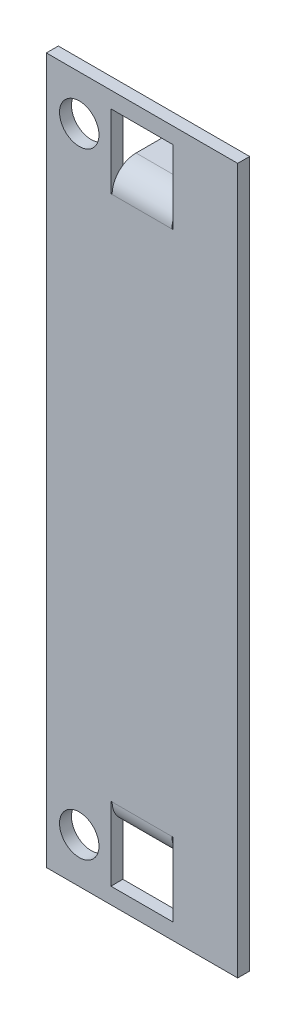
ISO-10303-21;
HEADER;
FILE_DESCRIPTION(('STEP AP214'),'2;1');
FILE_NAME('part.step','',(''),(''),'','','');
FILE_SCHEMA(('AUTOMOTIVE_DESIGN { 1 0 10303 214 1 1 1 1 }'));
ENDSEC;
DATA;
#1=APPLICATION_CONTEXT('core data for automotive mechanical design processes');
#2=APPLICATION_PROTOCOL_DEFINITION('international standard','automotive_design',2000,#1);
#3=PRODUCT_CONTEXT('',#1,'mechanical');
#4=PRODUCT('Part','Part','',(#3));
#5=PRODUCT_RELATED_PRODUCT_CATEGORY('part','',(#4));
#6=PRODUCT_DEFINITION_FORMATION('','',#4);
#7=PRODUCT_DEFINITION_CONTEXT('part definition',#1,'design');
#8=PRODUCT_DEFINITION('design','',#6,#7);
#9=PRODUCT_DEFINITION_SHAPE('','',#8);
#10=(LENGTH_UNIT() NAMED_UNIT(*) SI_UNIT(.MILLI.,.METRE.));
#11=(NAMED_UNIT(*) PLANE_ANGLE_UNIT() SI_UNIT($,.RADIAN.));
#12=(NAMED_UNIT(*) SI_UNIT($,.STERADIAN.) SOLID_ANGLE_UNIT());
#13=UNCERTAINTY_MEASURE_WITH_UNIT(LENGTH_MEASURE(1.E-05),#10,'distance_accuracy_value','');
#14=(GEOMETRIC_REPRESENTATION_CONTEXT(3) GLOBAL_UNCERTAINTY_ASSIGNED_CONTEXT((#13)) GLOBAL_UNIT_ASSIGNED_CONTEXT((#10,
#11,#12)) REPRESENTATION_CONTEXT('',''));
#15=CARTESIAN_POINT('',(0.,0.,0.));
#16=DIRECTION('',(0.,0.,1.));
#17=DIRECTION('',(1.,0.,0.));
#18=AXIS2_PLACEMENT_3D('',#15,#16,#17);
#19=CARTESIAN_POINT('',(-12.7,44.,142.2));
#20=DIRECTION('',(0.,1.,0.));
#21=DIRECTION('',(0.,0.,1.));
#22=AXIS2_PLACEMENT_3D('',#19,#20,#21);
#23=PLANE('',#22);
#24=DIRECTION('',(-1.,0.,0.));
#25=VECTOR('',#24,1.);
#26=CARTESIAN_POINT('',(0.,44.,142.));
#27=LINE('',#26,#25);
#28=CARTESIAN_POINT('',(-12.5,44.,142.));
#29=VERTEX_POINT('',#28);
#30=CARTESIAN_POINT('',(-12.7,44.,142.));
#31=VERTEX_POINT('',#30);
#32=EDGE_CURVE('E67',#29,#31,#27,.T.);
#33=ORIENTED_EDGE('',*,*,#32,.F.);
#34=DIRECTION('',(0.,0.,-1.));
#35=VECTOR('',#34,1.);
#36=CARTESIAN_POINT('',(-12.5,44.,140.));
#37=LINE('',#36,#35);
#38=CARTESIAN_POINT('',(-12.5,44.,140.));
#39=VERTEX_POINT('',#38);
#40=EDGE_CURVE('E266',#29,#39,#37,.T.);
#41=ORIENTED_EDGE('',*,*,#40,.T.);
#42=DIRECTION('',(-1.,0.,0.));
#43=VECTOR('',#42,1.);
#44=CARTESIAN_POINT('',(0.,44.,140.));
#45=LINE('',#44,#43);
#46=CARTESIAN_POINT('',(-12.7,44.,140.));
#47=VERTEX_POINT('',#46);
#48=EDGE_CURVE('E359',#39,#47,#45,.T.);
#49=ORIENTED_EDGE('',*,*,#48,.T.);
#50=DIRECTION('',(0.,0.,-1.));
#51=VECTOR('',#50,1.);
#52=CARTESIAN_POINT('',(-12.7,44.,142.2));
#53=LINE('',#52,#51);
#54=EDGE_CURVE('E228',#31,#47,#53,.T.);
#55=ORIENTED_EDGE('',*,*,#54,.F.);
#56=EDGE_LOOP('',(#33,#41,#49,#55));
#57=FACE_BOUND('',#56,.T.);
#58=ADVANCED_FACE('F41',(#57),#23,.T.);
#59=CARTESIAN_POINT('',(-2.3,-44.,142.2));
#60=DIRECTION('',(0.,-1.,0.));
#61=DIRECTION('',(0.,0.,-1.));
#62=AXIS2_PLACEMENT_3D('',#59,#60,#61);
#63=PLANE('',#62);
#64=DIRECTION('',(1.,0.,0.));
#65=VECTOR('',#64,1.);
#66=CARTESIAN_POINT('',(0.,-44.,140.));
#67=LINE('',#66,#65);
#68=CARTESIAN_POINT('',(-12.7,-44.,140.));
#69=VERTEX_POINT('',#68);
#70=CARTESIAN_POINT('',(-12.5,-44.,140.));
#71=VERTEX_POINT('',#70);
#72=EDGE_CURVE('E368',#69,#71,#67,.T.);
#73=ORIENTED_EDGE('',*,*,#72,.T.);
#74=DIRECTION('',(0.,0.,1.));
#75=VECTOR('',#74,1.);
#76=CARTESIAN_POINT('',(-12.5,-44.,140.));
#77=LINE('',#76,#75);
#78=CARTESIAN_POINT('',(-12.5,-44.,142.));
#79=VERTEX_POINT('',#78);
#80=EDGE_CURVE('E59',#71,#79,#77,.T.);
#81=ORIENTED_EDGE('',*,*,#80,.T.);
#82=DIRECTION('',(1.,0.,0.));
#83=VECTOR('',#82,1.);
#84=CARTESIAN_POINT('',(0.,-44.,142.));
#85=LINE('',#84,#83);
#86=CARTESIAN_POINT('',(-12.7,-44.,142.));
#87=VERTEX_POINT('',#86);
#88=EDGE_CURVE('E314',#87,#79,#85,.T.);
#89=ORIENTED_EDGE('',*,*,#88,.F.);
#90=DIRECTION('',(0.,0.,-1.));
#91=VECTOR('',#90,1.);
#92=CARTESIAN_POINT('',(-12.7,-44.,142.2));
#93=LINE('',#92,#91);
#94=EDGE_CURVE('E284',#87,#69,#93,.T.);
#95=ORIENTED_EDGE('',*,*,#94,.T.);
#96=EDGE_LOOP('',(#73,#81,#89,#95));
#97=FACE_BOUND('',#96,.T.);
#98=ADVANCED_FACE('F435',(#97),#63,.T.);
#99=CARTESIAN_POINT('',(0.,0.,142.));
#100=DIRECTION('',(0.,0.,1.));
#101=DIRECTION('',(1.,0.,0.));
#102=AXIS2_PLACEMENT_3D('',#99,#100,#101);
#103=PLANE('',#102);
#104=CARTESIAN_POINT('',(-18.,-51.5,142.));
#105=DIRECTION('',(0.,0.,1.));
#106=DIRECTION('',(1.,0.,0.));
#107=AXIS2_PLACEMENT_3D('',#104,#105,#106);
#108=CIRCLE('',#107,3.3);
#109=CARTESIAN_POINT('',(-14.7,-51.5,142.));
#110=VERTEX_POINT('',#109);
#111=EDGE_CURVE('E241',#110,#110,#108,.F.);
#112=ORIENTED_EDGE('',*,*,#111,.T.);
#113=EDGE_LOOP('',(#112));
#114=FACE_BOUND('',#113,.T.);
#115=CARTESIAN_POINT('',(-18.,51.5,142.));
#116=DIRECTION('',(0.,0.,1.));
#117=DIRECTION('',(1.,0.,0.));
#118=AXIS2_PLACEMENT_3D('',#115,#116,#117);
#119=CIRCLE('',#118,3.3);
#120=CARTESIAN_POINT('',(-14.7,51.5,142.));
#121=VERTEX_POINT('',#120);
#122=EDGE_CURVE('E375',#121,#121,#119,.F.);
#123=ORIENTED_EDGE('',*,*,#122,.T.);
#124=EDGE_LOOP('',(#123));
#125=FACE_BOUND('',#124,.T.);
#126=DIRECTION('',(0.,-1.,0.));
#127=VECTOR('',#126,1.);
#128=CARTESIAN_POINT('',(-23.5,59.,142.));
#129=LINE('',#128,#127);
#130=CARTESIAN_POINT('',(-23.5,59.,142.));
#131=VERTEX_POINT('',#130);
#132=CARTESIAN_POINT('',(-23.5,-59.,142.));
#133=VERTEX_POINT('',#132);
#134=EDGE_CURVE('E326',#131,#133,#129,.T.);
#135=ORIENTED_EDGE('',*,*,#134,.T.);
#136=DIRECTION('',(1.,0.,0.));
#137=VECTOR('',#136,1.);
#138=CARTESIAN_POINT('',(-23.5,-59.,142.));
#139=LINE('',#138,#137);
#140=CARTESIAN_POINT('',(8.5,-59.,142.));
#141=VERTEX_POINT('',#140);
#142=EDGE_CURVE('E328',#133,#141,#139,.T.);
#143=ORIENTED_EDGE('',*,*,#142,.T.);
#144=DIRECTION('',(0.,1.,0.));
#145=VECTOR('',#144,1.);
#146=CARTESIAN_POINT('',(8.5,-59.,142.));
#147=LINE('',#146,#145);
#148=CARTESIAN_POINT('',(8.5,59.,142.));
#149=VERTEX_POINT('',#148);
#150=EDGE_CURVE('E335',#141,#149,#147,.T.);
#151=ORIENTED_EDGE('',*,*,#150,.T.);
#152=DIRECTION('',(-1.,0.,0.));
#153=VECTOR('',#152,1.);
#154=CARTESIAN_POINT('',(8.5,59.,142.));
#155=LINE('',#154,#153);
#156=EDGE_CURVE('E331',#149,#131,#155,.T.);
#157=ORIENTED_EDGE('',*,*,#156,.T.);
#158=EDGE_LOOP('',(#135,#143,#151,#157));
#159=FACE_BOUND('',#158,.T.);
#160=CARTESIAN_POINT('',(-2.3,44.,142.));
#161=VERTEX_POINT('',#160);
#162=CARTESIAN_POINT('',(-2.5,44.,142.));
#163=VERTEX_POINT('',#162);
#164=EDGE_CURVE('E307',#161,#163,#27,.T.);
#165=ORIENTED_EDGE('',*,*,#164,.T.);
#166=DIRECTION('',(-1.,0.,0.));
#167=VECTOR('',#166,1.);
#168=CARTESIAN_POINT('',(-2.5,44.,142.));
#169=LINE('',#168,#167);
#170=EDGE_CURVE('E236',#163,#29,#169,.T.);
#171=ORIENTED_EDGE('',*,*,#170,.T.);
#172=ORIENTED_EDGE('',*,*,#32,.T.);
#173=DIRECTION('',(0.,1.,0.));
#174=VECTOR('',#173,1.);
#175=CARTESIAN_POINT('',(-12.7,0.,142.));
#176=LINE('',#175,#174);
#177=CARTESIAN_POINT('',(-12.7,56.3,142.));
#178=VERTEX_POINT('',#177);
#179=EDGE_CURVE('E309',#31,#178,#176,.T.);
#180=ORIENTED_EDGE('',*,*,#179,.T.);
#181=DIRECTION('',(1.,0.,0.));
#182=VECTOR('',#181,1.);
#183=CARTESIAN_POINT('',(0.,56.3,142.));
#184=LINE('',#183,#182);
#185=CARTESIAN_POINT('',(-2.3,56.3,142.));
#186=VERTEX_POINT('',#185);
#187=EDGE_CURVE('E294',#178,#186,#184,.T.);
#188=ORIENTED_EDGE('',*,*,#187,.T.);
#189=DIRECTION('',(0.,-1.,0.));
#190=VECTOR('',#189,1.);
#191=CARTESIAN_POINT('',(-2.3,0.,142.));
#192=LINE('',#191,#190);
#193=EDGE_CURVE('E304',#186,#161,#192,.T.);
#194=ORIENTED_EDGE('',*,*,#193,.T.);
#195=EDGE_LOOP('',(#165,#171,#172,#180,#188,#194));
#196=FACE_BOUND('',#195,.T.);
#197=DIRECTION('',(-1.,0.,0.));
#198=VECTOR('',#197,1.);
#199=CARTESIAN_POINT('',(0.,-56.3,142.));
#200=LINE('',#199,#198);
#201=CARTESIAN_POINT('',(-2.3,-56.3,142.));
#202=VERTEX_POINT('',#201);
#203=CARTESIAN_POINT('',(-12.7,-56.3,142.));
#204=VERTEX_POINT('',#203);
#205=EDGE_CURVE('E317',#202,#204,#200,.T.);
#206=ORIENTED_EDGE('',*,*,#205,.T.);
#207=DIRECTION('',(0.,1.,0.));
#208=VECTOR('',#207,1.);
#209=CARTESIAN_POINT('',(-12.7,0.,142.));
#210=LINE('',#209,#208);
#211=EDGE_CURVE('E325',#204,#87,#210,.T.);
#212=ORIENTED_EDGE('',*,*,#211,.T.);
#213=ORIENTED_EDGE('',*,*,#88,.T.);
#214=DIRECTION('',(-1.,0.,0.));
#215=VECTOR('',#214,1.);
#216=CARTESIAN_POINT('',(-2.5,-44.,142.));
#217=LINE('',#216,#215);
#218=CARTESIAN_POINT('',(-2.5,-44.,142.));
#219=VERTEX_POINT('',#218);
#220=EDGE_CURVE('E386',#219,#79,#217,.T.);
#221=ORIENTED_EDGE('',*,*,#220,.F.);
#222=CARTESIAN_POINT('',(-2.3,-44.,142.));
#223=VERTEX_POINT('',#222);
#224=EDGE_CURVE('E311',#219,#223,#85,.T.);
#225=ORIENTED_EDGE('',*,*,#224,.T.);
#226=DIRECTION('',(0.,-1.,0.));
#227=VECTOR('',#226,1.);
#228=CARTESIAN_POINT('',(-2.3,0.,142.));
#229=LINE('',#228,#227);
#230=EDGE_CURVE('E316',#223,#202,#229,.T.);
#231=ORIENTED_EDGE('',*,*,#230,.T.);
#232=EDGE_LOOP('',(#206,#212,#213,#221,#225,#231));
#233=FACE_BOUND('',#232,.T.);
#234=ADVANCED_FACE('F438',(#114,#125,#159,#196,#233),#103,.T.);
#235=CARTESIAN_POINT('',(0.,0.,140.));
#236=DIRECTION('',(0.,0.,1.));
#237=DIRECTION('',(1.,0.,0.));
#238=AXIS2_PLACEMENT_3D('',#235,#236,#237);
#239=PLANE('',#238);
#240=CARTESIAN_POINT('',(-18.,-51.5,140.));
#241=DIRECTION('',(0.,0.,1.));
#242=DIRECTION('',(1.,0.,0.));
#243=AXIS2_PLACEMENT_3D('',#240,#241,#242);
#244=CIRCLE('',#243,3.3);
#245=CARTESIAN_POINT('',(-14.7,-51.5,140.));
#246=VERTEX_POINT('',#245);
#247=EDGE_CURVE('E44',#246,#246,#244,.F.);
#248=ORIENTED_EDGE('',*,*,#247,.F.);
#249=EDGE_LOOP('',(#248));
#250=FACE_BOUND('',#249,.T.);
#251=CARTESIAN_POINT('',(-18.,51.5,140.));
#252=DIRECTION('',(0.,0.,1.));
#253=DIRECTION('',(1.,0.,0.));
#254=AXIS2_PLACEMENT_3D('',#251,#252,#253);
#255=CIRCLE('',#254,3.3);
#256=CARTESIAN_POINT('',(-14.7,51.5,140.));
#257=VERTEX_POINT('',#256);
#258=EDGE_CURVE('E367',#257,#257,#255,.F.);
#259=ORIENTED_EDGE('',*,*,#258,.F.);
#260=EDGE_LOOP('',(#259));
#261=FACE_BOUND('',#260,.T.);
#262=DIRECTION('',(0.,1.,0.));
#263=VECTOR('',#262,1.);
#264=CARTESIAN_POINT('',(-12.7,0.,140.));
#265=LINE('',#264,#263);
#266=CARTESIAN_POINT('',(-12.7,56.3,140.));
#267=VERTEX_POINT('',#266);
#268=EDGE_CURVE('E362',#47,#267,#265,.T.);
#269=ORIENTED_EDGE('',*,*,#268,.F.);
#270=ORIENTED_EDGE('',*,*,#48,.F.);
#271=DIRECTION('',(-1.,0.,0.));
#272=VECTOR('',#271,1.);
#273=CARTESIAN_POINT('',(-2.5,44.,140.));
#274=LINE('',#273,#272);
#275=CARTESIAN_POINT('',(-2.5,44.,140.));
#276=VERTEX_POINT('',#275);
#277=EDGE_CURVE('E238',#276,#39,#274,.T.);
#278=ORIENTED_EDGE('',*,*,#277,.F.);
#279=CARTESIAN_POINT('',(-2.3,44.,140.));
#280=VERTEX_POINT('',#279);
#281=EDGE_CURVE('E356',#280,#276,#45,.T.);
#282=ORIENTED_EDGE('',*,*,#281,.F.);
#283=DIRECTION('',(0.,-1.,0.));
#284=VECTOR('',#283,1.);
#285=CARTESIAN_POINT('',(-2.3,0.,140.));
#286=LINE('',#285,#284);
#287=CARTESIAN_POINT('',(-2.3,56.3,140.));
#288=VERTEX_POINT('',#287);
#289=EDGE_CURVE('E360',#288,#280,#286,.T.);
#290=ORIENTED_EDGE('',*,*,#289,.F.);
#291=DIRECTION('',(1.,0.,0.));
#292=VECTOR('',#291,1.);
#293=CARTESIAN_POINT('',(0.,56.3,140.));
#294=LINE('',#293,#292);
#295=EDGE_CURVE('E355',#267,#288,#294,.T.);
#296=ORIENTED_EDGE('',*,*,#295,.F.);
#297=EDGE_LOOP('',(#269,#270,#278,#282,#290,#296));
#298=FACE_BOUND('',#297,.T.);
#299=DIRECTION('',(0.,-1.,0.));
#300=VECTOR('',#299,1.);
#301=CARTESIAN_POINT('',(-23.5,59.,140.));
#302=LINE('',#301,#300);
#303=CARTESIAN_POINT('',(-23.5,59.,140.));
#304=VERTEX_POINT('',#303);
#305=CARTESIAN_POINT('',(-23.5,-59.,140.));
#306=VERTEX_POINT('',#305);
#307=EDGE_CURVE('E324',#304,#306,#302,.T.);
#308=ORIENTED_EDGE('',*,*,#307,.F.);
#309=DIRECTION('',(-1.,0.,0.));
#310=VECTOR('',#309,1.);
#311=CARTESIAN_POINT('',(8.5,59.,140.));
#312=LINE('',#311,#310);
#313=CARTESIAN_POINT('',(8.5,59.,140.));
#314=VERTEX_POINT('',#313);
#315=EDGE_CURVE('E329',#314,#304,#312,.T.);
#316=ORIENTED_EDGE('',*,*,#315,.F.);
#317=DIRECTION('',(0.,1.,0.));
#318=VECTOR('',#317,1.);
#319=CARTESIAN_POINT('',(8.5,-59.,140.));
#320=LINE('',#319,#318);
#321=CARTESIAN_POINT('',(8.5,-59.,140.));
#322=VERTEX_POINT('',#321);
#323=EDGE_CURVE('E342',#322,#314,#320,.T.);
#324=ORIENTED_EDGE('',*,*,#323,.F.);
#325=DIRECTION('',(1.,0.,0.));
#326=VECTOR('',#325,1.);
#327=CARTESIAN_POINT('',(-23.5,-59.,140.));
#328=LINE('',#327,#326);
#329=EDGE_CURVE('E338',#306,#322,#328,.T.);
#330=ORIENTED_EDGE('',*,*,#329,.F.);
#331=EDGE_LOOP('',(#308,#316,#324,#330));
#332=FACE_BOUND('',#331,.T.);
#333=DIRECTION('',(0.,1.,0.));
#334=VECTOR('',#333,1.);
#335=CARTESIAN_POINT('',(-12.7,0.,140.));
#336=LINE('',#335,#334);
#337=CARTESIAN_POINT('',(-12.7,-56.3,140.));
#338=VERTEX_POINT('',#337);
#339=EDGE_CURVE('E11',#338,#69,#336,.T.);
#340=ORIENTED_EDGE('',*,*,#339,.F.);
#341=DIRECTION('',(-1.,0.,0.));
#342=VECTOR('',#341,1.);
#343=CARTESIAN_POINT('',(0.,-56.3,140.));
#344=LINE('',#343,#342);
#345=CARTESIAN_POINT('',(-2.3,-56.3,140.));
#346=VERTEX_POINT('',#345);
#347=EDGE_CURVE('E49',#346,#338,#344,.T.);
#348=ORIENTED_EDGE('',*,*,#347,.F.);
#349=DIRECTION('',(0.,-1.,0.));
#350=VECTOR('',#349,1.);
#351=CARTESIAN_POINT('',(-2.3,0.,140.));
#352=LINE('',#351,#350);
#353=CARTESIAN_POINT('',(-2.3,-44.,140.));
#354=VERTEX_POINT('',#353);
#355=EDGE_CURVE('E366',#354,#346,#352,.T.);
#356=ORIENTED_EDGE('',*,*,#355,.F.);
#357=CARTESIAN_POINT('',(-2.5,-44.,140.));
#358=VERTEX_POINT('',#357);
#359=EDGE_CURVE('E364',#358,#354,#67,.T.);
#360=ORIENTED_EDGE('',*,*,#359,.F.);
#361=DIRECTION('',(-1.,0.,0.));
#362=VECTOR('',#361,1.);
#363=CARTESIAN_POINT('',(-2.5,-44.,140.));
#364=LINE('',#363,#362);
#365=EDGE_CURVE('E405',#358,#71,#364,.T.);
#366=ORIENTED_EDGE('',*,*,#365,.T.);
#367=ORIENTED_EDGE('',*,*,#72,.F.);
#368=EDGE_LOOP('',(#340,#348,#356,#360,#366,#367));
#369=FACE_BOUND('',#368,.T.);
#370=ADVANCED_FACE('F483',(#250,#261,#298,#332,#369),#239,.F.);
#371=CARTESIAN_POINT('',(-23.5,59.,142.));
#372=DIRECTION('',(1.,0.,0.));
#373=DIRECTION('',(0.,0.,-1.));
#374=AXIS2_PLACEMENT_3D('',#371,#372,#373);
#375=PLANE('',#374);
#376=ORIENTED_EDGE('',*,*,#307,.T.);
#377=DIRECTION('',(0.,0.,-1.));
#378=VECTOR('',#377,1.);
#379=CARTESIAN_POINT('',(-23.5,-59.,142.));
#380=LINE('',#379,#378);
#381=EDGE_CURVE('E352',#133,#306,#380,.T.);
#382=ORIENTED_EDGE('',*,*,#381,.F.);
#383=ORIENTED_EDGE('',*,*,#134,.F.);
#384=DIRECTION('',(0.,0.,-1.));
#385=VECTOR('',#384,1.);
#386=CARTESIAN_POINT('',(-23.5,59.,142.));
#387=LINE('',#386,#385);
#388=EDGE_CURVE('E336',#131,#304,#387,.T.);
#389=ORIENTED_EDGE('',*,*,#388,.T.);
#390=EDGE_LOOP('',(#376,#382,#383,#389));
#391=FACE_BOUND('',#390,.T.);
#392=ADVANCED_FACE('F43',(#391),#375,.F.);
#393=CARTESIAN_POINT('',(-23.5,-59.,142.));
#394=DIRECTION('',(0.,1.,0.));
#395=DIRECTION('',(0.,0.,1.));
#396=AXIS2_PLACEMENT_3D('',#393,#394,#395);
#397=PLANE('',#396);
#398=ORIENTED_EDGE('',*,*,#329,.T.);
#399=DIRECTION('',(0.,0.,-1.));
#400=VECTOR('',#399,1.);
#401=CARTESIAN_POINT('',(8.5,-59.,142.));
#402=LINE('',#401,#400);
#403=EDGE_CURVE('E349',#141,#322,#402,.T.);
#404=ORIENTED_EDGE('',*,*,#403,.F.);
#405=ORIENTED_EDGE('',*,*,#142,.F.);
#406=ORIENTED_EDGE('',*,*,#381,.T.);
#407=EDGE_LOOP('',(#398,#404,#405,#406));
#408=FACE_BOUND('',#407,.T.);
#409=ADVANCED_FACE('F551',(#408),#397,.F.);
#410=CARTESIAN_POINT('',(8.5,-59.,142.));
#411=DIRECTION('',(-1.,0.,0.));
#412=DIRECTION('',(0.,0.,1.));
#413=AXIS2_PLACEMENT_3D('',#410,#411,#412);
#414=PLANE('',#413);
#415=ORIENTED_EDGE('',*,*,#323,.T.);
#416=DIRECTION('',(0.,0.,-1.));
#417=VECTOR('',#416,1.);
#418=CARTESIAN_POINT('',(8.5,59.,142.));
#419=LINE('',#418,#417);
#420=EDGE_CURVE('E347',#149,#314,#419,.T.);
#421=ORIENTED_EDGE('',*,*,#420,.F.);
#422=ORIENTED_EDGE('',*,*,#150,.F.);
#423=ORIENTED_EDGE('',*,*,#403,.T.);
#424=EDGE_LOOP('',(#415,#421,#422,#423));
#425=FACE_BOUND('',#424,.T.);
#426=ADVANCED_FACE('F552',(#425),#414,.F.);
#427=CARTESIAN_POINT('',(8.5,59.,142.));
#428=DIRECTION('',(0.,-1.,0.));
#429=DIRECTION('',(0.,0.,-1.));
#430=AXIS2_PLACEMENT_3D('',#427,#428,#429);
#431=PLANE('',#430);
#432=ORIENTED_EDGE('',*,*,#315,.T.);
#433=ORIENTED_EDGE('',*,*,#388,.F.);
#434=ORIENTED_EDGE('',*,*,#156,.F.);
#435=ORIENTED_EDGE('',*,*,#420,.T.);
#436=EDGE_LOOP('',(#432,#433,#434,#435));
#437=FACE_BOUND('',#436,.T.);
#438=ADVANCED_FACE('F451',(#437),#431,.F.);
#439=CARTESIAN_POINT('',(-12.7,56.3,142.2));
#440=DIRECTION('',(1.,0.,0.));
#441=DIRECTION('',(0.,0.,-1.));
#442=AXIS2_PLACEMENT_3D('',#439,#440,#441);
#443=PLANE('',#442);
#444=ORIENTED_EDGE('',*,*,#54,.T.);
#445=ORIENTED_EDGE('',*,*,#268,.T.);
#446=DIRECTION('',(0.,0.,-1.));
#447=VECTOR('',#446,1.);
#448=CARTESIAN_POINT('',(-12.7,56.3,142.2));
#449=LINE('',#448,#447);
#450=EDGE_CURVE('E287',#178,#267,#449,.T.);
#451=ORIENTED_EDGE('',*,*,#450,.F.);
#452=ORIENTED_EDGE('',*,*,#179,.F.);
#453=EDGE_LOOP('',(#444,#445,#451,#452));
#454=FACE_BOUND('',#453,.T.);
#455=ADVANCED_FACE('F446',(#454),#443,.T.);
#456=DIRECTION('',(0.,0.,-1.));
#457=VECTOR('',#456,1.);
#458=CARTESIAN_POINT('',(-2.5,44.,140.));
#459=LINE('',#458,#457);
#460=EDGE_CURVE('E279',#163,#276,#459,.T.);
#461=ORIENTED_EDGE('',*,*,#460,.F.);
#462=ORIENTED_EDGE('',*,*,#164,.F.);
#463=DIRECTION('',(0.,0.,-1.));
#464=VECTOR('',#463,1.);
#465=CARTESIAN_POINT('',(-2.3,44.,142.2));
#466=LINE('',#465,#464);
#467=EDGE_CURVE('E235',#161,#280,#466,.T.);
#468=ORIENTED_EDGE('',*,*,#467,.T.);
#469=ORIENTED_EDGE('',*,*,#281,.T.);
#470=EDGE_LOOP('',(#461,#462,#468,#469));
#471=FACE_BOUND('',#470,.T.);
#472=ADVANCED_FACE('F432',(#471),#23,.T.);
#473=CARTESIAN_POINT('',(-2.3,44.,142.2));
#474=DIRECTION('',(-1.,0.,0.));
#475=DIRECTION('',(0.,0.,1.));
#476=AXIS2_PLACEMENT_3D('',#473,#474,#475);
#477=PLANE('',#476);
#478=DIRECTION('',(0.,0.,-1.));
#479=VECTOR('',#478,1.);
#480=CARTESIAN_POINT('',(-2.3,56.3,142.2));
#481=LINE('',#480,#479);
#482=EDGE_CURVE('E299',#186,#288,#481,.T.);
#483=ORIENTED_EDGE('',*,*,#482,.T.);
#484=ORIENTED_EDGE('',*,*,#289,.T.);
#485=ORIENTED_EDGE('',*,*,#467,.F.);
#486=ORIENTED_EDGE('',*,*,#193,.F.);
#487=EDGE_LOOP('',(#483,#484,#485,#486));
#488=FACE_BOUND('',#487,.T.);
#489=ADVANCED_FACE('F443',(#488),#477,.T.);
#490=CARTESIAN_POINT('',(-2.3,56.3,142.2));
#491=DIRECTION('',(0.,-1.,0.));
#492=DIRECTION('',(0.,0.,-1.));
#493=AXIS2_PLACEMENT_3D('',#490,#491,#492);
#494=PLANE('',#493);
#495=ORIENTED_EDGE('',*,*,#450,.T.);
#496=ORIENTED_EDGE('',*,*,#295,.T.);
#497=ORIENTED_EDGE('',*,*,#482,.F.);
#498=ORIENTED_EDGE('',*,*,#187,.F.);
#499=EDGE_LOOP('',(#495,#496,#497,#498));
#500=FACE_BOUND('',#499,.T.);
#501=ADVANCED_FACE('F455',(#500),#494,.T.);
#502=CARTESIAN_POINT('',(-12.7,-44.,142.2));
#503=DIRECTION('',(1.,0.,0.));
#504=DIRECTION('',(0.,0.,-1.));
#505=AXIS2_PLACEMENT_3D('',#502,#503,#504);
#506=PLANE('',#505);
#507=DIRECTION('',(0.,0.,-1.));
#508=VECTOR('',#507,1.);
#509=CARTESIAN_POINT('',(-12.7,-56.3,142.2));
#510=LINE('',#509,#508);
#511=EDGE_CURVE('E295',#204,#338,#510,.T.);
#512=ORIENTED_EDGE('',*,*,#511,.T.);
#513=ORIENTED_EDGE('',*,*,#339,.T.);
#514=ORIENTED_EDGE('',*,*,#94,.F.);
#515=ORIENTED_EDGE('',*,*,#211,.F.);
#516=EDGE_LOOP('',(#512,#513,#514,#515));
#517=FACE_BOUND('',#516,.T.);
#518=ADVANCED_FACE('F518',(#517),#506,.T.);
#519=CARTESIAN_POINT('',(-12.7,-56.3,142.2));
#520=DIRECTION('',(0.,1.,0.));
#521=DIRECTION('',(0.,0.,1.));
#522=AXIS2_PLACEMENT_3D('',#519,#520,#521);
#523=PLANE('',#522);
#524=DIRECTION('',(0.,0.,-1.));
#525=VECTOR('',#524,1.);
#526=CARTESIAN_POINT('',(-2.3,-56.3,142.2));
#527=LINE('',#526,#525);
#528=EDGE_CURVE('E289',#202,#346,#527,.T.);
#529=ORIENTED_EDGE('',*,*,#528,.T.);
#530=ORIENTED_EDGE('',*,*,#347,.T.);
#531=ORIENTED_EDGE('',*,*,#511,.F.);
#532=ORIENTED_EDGE('',*,*,#205,.F.);
#533=EDGE_LOOP('',(#529,#530,#531,#532));
#534=FACE_BOUND('',#533,.T.);
#535=ADVANCED_FACE('F513',(#534),#523,.T.);
#536=CARTESIAN_POINT('',(-2.3,-56.3,142.2));
#537=DIRECTION('',(-1.,0.,0.));
#538=DIRECTION('',(0.,0.,1.));
#539=AXIS2_PLACEMENT_3D('',#536,#537,#538);
#540=PLANE('',#539);
#541=DIRECTION('',(0.,0.,-1.));
#542=VECTOR('',#541,1.);
#543=CARTESIAN_POINT('',(-2.3,-44.,142.2));
#544=LINE('',#543,#542);
#545=EDGE_CURVE('E285',#223,#354,#544,.T.);
#546=ORIENTED_EDGE('',*,*,#545,.T.);
#547=ORIENTED_EDGE('',*,*,#355,.T.);
#548=ORIENTED_EDGE('',*,*,#528,.F.);
#549=ORIENTED_EDGE('',*,*,#230,.F.);
#550=EDGE_LOOP('',(#546,#547,#548,#549));
#551=FACE_BOUND('',#550,.T.);
#552=ADVANCED_FACE('F515',(#551),#540,.T.);
#553=DIRECTION('',(0.,0.,1.));
#554=VECTOR('',#553,1.);
#555=CARTESIAN_POINT('',(-2.5,-44.,140.));
#556=LINE('',#555,#554);
#557=EDGE_CURVE('E225',#358,#219,#556,.T.);
#558=ORIENTED_EDGE('',*,*,#557,.F.);
#559=ORIENTED_EDGE('',*,*,#359,.T.);
#560=ORIENTED_EDGE('',*,*,#545,.F.);
#561=ORIENTED_EDGE('',*,*,#224,.F.);
#562=EDGE_LOOP('',(#558,#559,#560,#561));
#563=FACE_BOUND('',#562,.T.);
#564=ADVANCED_FACE('F442',(#563),#63,.T.);
#565=CARTESIAN_POINT('',(-2.5,-44.,138.));
#566=DIRECTION('',(-1.,0.,0.));
#567=DIRECTION('',(0.,0.,1.));
#568=AXIS2_PLACEMENT_3D('',#565,#566,#567);
#569=CYLINDRICAL_SURFACE('',#568,4.);
#570=CARTESIAN_POINT('',(-12.5,-44.,138.));
#571=DIRECTION('',(1.,0.,0.));
#572=DIRECTION('',(0.,0.,-1.));
#573=AXIS2_PLACEMENT_3D('',#570,#571,#572);
#574=CIRCLE('',#573,4.);
#575=CARTESIAN_POINT('',(-12.5,-48.,138.));
#576=VERTEX_POINT('',#575);
#577=EDGE_CURVE('E229',#79,#576,#574,.T.);
#578=ORIENTED_EDGE('',*,*,#577,.T.);
#579=DIRECTION('',(-1.,0.,0.));
#580=VECTOR('',#579,1.);
#581=CARTESIAN_POINT('',(-2.5,-48.,138.));
#582=LINE('',#581,#580);
#583=CARTESIAN_POINT('',(-2.5,-48.,138.));
#584=VERTEX_POINT('',#583);
#585=EDGE_CURVE('E207',#584,#576,#582,.T.);
#586=ORIENTED_EDGE('',*,*,#585,.F.);
#587=CARTESIAN_POINT('',(-2.5,-44.,138.));
#588=DIRECTION('',(1.,0.,0.));
#589=DIRECTION('',(0.,0.,-1.));
#590=AXIS2_PLACEMENT_3D('',#587,#588,#589);
#591=CIRCLE('',#590,4.);
#592=EDGE_CURVE('E216',#219,#584,#591,.T.);
#593=ORIENTED_EDGE('',*,*,#592,.F.);
#594=ORIENTED_EDGE('',*,*,#220,.T.);
#595=EDGE_LOOP('',(#578,#586,#593,#594));
#596=FACE_BOUND('',#595,.T.);
#597=ADVANCED_FACE('F226',(#596),#569,.T.);
#598=CARTESIAN_POINT('',(-2.5,-48.,138.));
#599=DIRECTION('',(0.,1.,0.));
#600=DIRECTION('',(0.,0.,1.));
#601=AXIS2_PLACEMENT_3D('',#598,#599,#600);
#602=PLANE('',#601);
#603=DIRECTION('',(0.,0.,-1.));
#604=VECTOR('',#603,1.);
#605=CARTESIAN_POINT('',(-12.5,-48.,138.));
#606=LINE('',#605,#604);
#607=CARTESIAN_POINT('',(-12.5,-48.,130.));
#608=VERTEX_POINT('',#607);
#609=EDGE_CURVE('E391',#576,#608,#606,.T.);
#610=ORIENTED_EDGE('',*,*,#609,.T.);
#611=DIRECTION('',(-1.,0.,0.));
#612=VECTOR('',#611,1.);
#613=CARTESIAN_POINT('',(-2.5,-48.,130.));
#614=LINE('',#613,#612);
#615=CARTESIAN_POINT('',(-2.5,-48.,130.));
#616=VERTEX_POINT('',#615);
#617=EDGE_CURVE('E215',#616,#608,#614,.T.);
#618=ORIENTED_EDGE('',*,*,#617,.F.);
#619=DIRECTION('',(0.,0.,-1.));
#620=VECTOR('',#619,1.);
#621=CARTESIAN_POINT('',(-2.5,-48.,138.));
#622=LINE('',#621,#620);
#623=EDGE_CURVE('E202',#584,#616,#622,.T.);
#624=ORIENTED_EDGE('',*,*,#623,.F.);
#625=ORIENTED_EDGE('',*,*,#585,.T.);
#626=EDGE_LOOP('',(#610,#618,#624,#625));
#627=FACE_BOUND('',#626,.T.);
#628=ADVANCED_FACE('F210',(#627),#602,.F.);
#629=CARTESIAN_POINT('',(-2.5,-48.,130.));
#630=DIRECTION('',(0.,0.,1.));
#631=DIRECTION('',(1.,0.,0.));
#632=AXIS2_PLACEMENT_3D('',#629,#630,#631);
#633=PLANE('',#632);
#634=DIRECTION('',(0.,1.,0.));
#635=VECTOR('',#634,1.);
#636=CARTESIAN_POINT('',(-12.5,-48.,130.));
#637=LINE('',#636,#635);
#638=CARTESIAN_POINT('',(-12.5,-46.,130.));
#639=VERTEX_POINT('',#638);
#640=EDGE_CURVE('E394',#608,#639,#637,.T.);
#641=ORIENTED_EDGE('',*,*,#640,.T.);
#642=DIRECTION('',(-1.,0.,0.));
#643=VECTOR('',#642,1.);
#644=CARTESIAN_POINT('',(-2.5,-46.,130.));
#645=LINE('',#644,#643);
#646=CARTESIAN_POINT('',(-2.5,-46.,130.));
#647=VERTEX_POINT('',#646);
#648=EDGE_CURVE('E234',#647,#639,#645,.T.);
#649=ORIENTED_EDGE('',*,*,#648,.F.);
#650=DIRECTION('',(0.,1.,0.));
#651=VECTOR('',#650,1.);
#652=CARTESIAN_POINT('',(-2.5,-48.,130.));
#653=LINE('',#652,#651);
#654=EDGE_CURVE('E214',#616,#647,#653,.T.);
#655=ORIENTED_EDGE('',*,*,#654,.F.);
#656=ORIENTED_EDGE('',*,*,#617,.T.);
#657=EDGE_LOOP('',(#641,#649,#655,#656));
#658=FACE_BOUND('',#657,.T.);
#659=ADVANCED_FACE('F425',(#658),#633,.F.);
#660=CARTESIAN_POINT('',(-2.5,-46.,130.));
#661=DIRECTION('',(0.,-1.,0.));
#662=DIRECTION('',(0.,0.,-1.));
#663=AXIS2_PLACEMENT_3D('',#660,#661,#662);
#664=PLANE('',#663);
#665=DIRECTION('',(0.,0.,1.));
#666=VECTOR('',#665,1.);
#667=CARTESIAN_POINT('',(-12.5,-46.,130.));
#668=LINE('',#667,#666);
#669=CARTESIAN_POINT('',(-12.5,-46.,138.));
#670=VERTEX_POINT('',#669);
#671=EDGE_CURVE('E395',#639,#670,#668,.T.);
#672=ORIENTED_EDGE('',*,*,#671,.T.);
#673=DIRECTION('',(-1.,0.,0.));
#674=VECTOR('',#673,1.);
#675=CARTESIAN_POINT('',(-2.5,-46.,138.));
#676=LINE('',#675,#674);
#677=CARTESIAN_POINT('',(-2.5,-46.,138.));
#678=VERTEX_POINT('',#677);
#679=EDGE_CURVE('E404',#678,#670,#676,.T.);
#680=ORIENTED_EDGE('',*,*,#679,.F.);
#681=DIRECTION('',(0.,0.,1.));
#682=VECTOR('',#681,1.);
#683=CARTESIAN_POINT('',(-2.5,-46.,130.));
#684=LINE('',#683,#682);
#685=EDGE_CURVE('E383',#647,#678,#684,.T.);
#686=ORIENTED_EDGE('',*,*,#685,.F.);
#687=ORIENTED_EDGE('',*,*,#648,.T.);
#688=EDGE_LOOP('',(#672,#680,#686,#687));
#689=FACE_BOUND('',#688,.T.);
#690=ADVANCED_FACE('F412',(#689),#664,.F.);
#691=CARTESIAN_POINT('',(-2.5,-44.,138.));
#692=DIRECTION('',(-1.,0.,0.));
#693=DIRECTION('',(0.,0.,1.));
#694=AXIS2_PLACEMENT_3D('',#691,#692,#693);
#695=CYLINDRICAL_SURFACE('',#694,2.);
#696=CARTESIAN_POINT('',(-12.5,-44.,138.));
#697=DIRECTION('',(-1.,0.,0.));
#698=DIRECTION('',(0.,0.,-1.));
#699=AXIS2_PLACEMENT_3D('',#696,#697,#698);
#700=CIRCLE('',#699,2.);
#701=EDGE_CURVE('E400',#670,#71,#700,.T.);
#702=ORIENTED_EDGE('',*,*,#701,.T.);
#703=ORIENTED_EDGE('',*,*,#365,.F.);
#704=CARTESIAN_POINT('',(-2.5,-44.,138.));
#705=DIRECTION('',(-1.,0.,0.));
#706=DIRECTION('',(0.,0.,-1.));
#707=AXIS2_PLACEMENT_3D('',#704,#705,#706);
#708=CIRCLE('',#707,2.);
#709=EDGE_CURVE('E387',#678,#358,#708,.T.);
#710=ORIENTED_EDGE('',*,*,#709,.F.);
#711=ORIENTED_EDGE('',*,*,#679,.T.);
#712=EDGE_LOOP('',(#702,#703,#710,#711));
#713=FACE_BOUND('',#712,.T.);
#714=ADVANCED_FACE('F419',(#713),#695,.F.);
#715=CARTESIAN_POINT('',(-2.5,-44.,138.));
#716=DIRECTION('',(1.,0.,0.));
#717=DIRECTION('',(0.,0.,-1.));
#718=AXIS2_PLACEMENT_3D('',#715,#716,#717);
#719=PLANE('',#718);
#720=ORIENTED_EDGE('',*,*,#592,.T.);
#721=ORIENTED_EDGE('',*,*,#623,.T.);
#722=ORIENTED_EDGE('',*,*,#654,.T.);
#723=ORIENTED_EDGE('',*,*,#685,.T.);
#724=ORIENTED_EDGE('',*,*,#709,.T.);
#725=ORIENTED_EDGE('',*,*,#557,.T.);
#726=EDGE_LOOP('',(#720,#721,#722,#723,#724,#725));
#727=FACE_BOUND('',#726,.T.);
#728=ADVANCED_FACE('F219',(#727),#719,.T.);
#729=CARTESIAN_POINT('',(-12.5,-44.,138.));
#730=DIRECTION('',(1.,0.,0.));
#731=DIRECTION('',(0.,0.,-1.));
#732=AXIS2_PLACEMENT_3D('',#729,#730,#731);
#733=PLANE('',#732);
#734=ORIENTED_EDGE('',*,*,#577,.F.);
#735=ORIENTED_EDGE('',*,*,#80,.F.);
#736=ORIENTED_EDGE('',*,*,#701,.F.);
#737=ORIENTED_EDGE('',*,*,#671,.F.);
#738=ORIENTED_EDGE('',*,*,#640,.F.);
#739=ORIENTED_EDGE('',*,*,#609,.F.);
#740=EDGE_LOOP('',(#734,#735,#736,#737,#738,#739));
#741=FACE_BOUND('',#740,.T.);
#742=ADVANCED_FACE('F417',(#741),#733,.F.);
#743=CARTESIAN_POINT('',(-2.5,44.,138.));
#744=DIRECTION('',(-1.,0.,0.));
#745=DIRECTION('',(0.,0.,1.));
#746=AXIS2_PLACEMENT_3D('',#743,#744,#745);
#747=CYLINDRICAL_SURFACE('',#746,4.);
#748=CARTESIAN_POINT('',(-12.5,44.,138.));
#749=DIRECTION('',(1.,0.,0.));
#750=DIRECTION('',(0.,0.,-1.));
#751=AXIS2_PLACEMENT_3D('',#748,#749,#750);
#752=CIRCLE('',#751,4.);
#753=CARTESIAN_POINT('',(-12.5,48.,138.));
#754=VERTEX_POINT('',#753);
#755=EDGE_CURVE('E268',#754,#29,#752,.T.);
#756=ORIENTED_EDGE('',*,*,#755,.T.);
#757=ORIENTED_EDGE('',*,*,#170,.F.);
#758=CARTESIAN_POINT('',(-2.5,44.,138.));
#759=DIRECTION('',(1.,0.,0.));
#760=DIRECTION('',(0.,0.,-1.));
#761=AXIS2_PLACEMENT_3D('',#758,#759,#760);
#762=CIRCLE('',#761,4.);
#763=CARTESIAN_POINT('',(-2.5,48.,138.));
#764=VERTEX_POINT('',#763);
#765=EDGE_CURVE('E257',#764,#163,#762,.T.);
#766=ORIENTED_EDGE('',*,*,#765,.F.);
#767=DIRECTION('',(-1.,0.,0.));
#768=VECTOR('',#767,1.);
#769=CARTESIAN_POINT('',(-2.5,48.,138.));
#770=LINE('',#769,#768);
#771=EDGE_CURVE('E251',#764,#754,#770,.T.);
#772=ORIENTED_EDGE('',*,*,#771,.T.);
#773=EDGE_LOOP('',(#756,#757,#766,#772));
#774=FACE_BOUND('',#773,.T.);
#775=ADVANCED_FACE('F472',(#774),#747,.T.);
#776=CARTESIAN_POINT('',(-2.5,44.,138.));
#777=DIRECTION('',(-1.,0.,0.));
#778=DIRECTION('',(0.,0.,1.));
#779=AXIS2_PLACEMENT_3D('',#776,#777,#778);
#780=CYLINDRICAL_SURFACE('',#779,2.);
#781=CARTESIAN_POINT('',(-12.5,44.,138.));
#782=DIRECTION('',(-1.,0.,0.));
#783=DIRECTION('',(0.,0.,-1.));
#784=AXIS2_PLACEMENT_3D('',#781,#782,#783);
#785=CIRCLE('',#784,2.);
#786=CARTESIAN_POINT('',(-12.5,46.,138.));
#787=VERTEX_POINT('',#786);
#788=EDGE_CURVE('E262',#39,#787,#785,.T.);
#789=ORIENTED_EDGE('',*,*,#788,.T.);
#790=DIRECTION('',(-1.,0.,0.));
#791=VECTOR('',#790,1.);
#792=CARTESIAN_POINT('',(-2.5,46.,138.));
#793=LINE('',#792,#791);
#794=CARTESIAN_POINT('',(-2.5,46.,138.));
#795=VERTEX_POINT('',#794);
#796=EDGE_CURVE('E243',#795,#787,#793,.T.);
#797=ORIENTED_EDGE('',*,*,#796,.F.);
#798=CARTESIAN_POINT('',(-2.5,44.,138.));
#799=DIRECTION('',(-1.,0.,0.));
#800=DIRECTION('',(0.,0.,-1.));
#801=AXIS2_PLACEMENT_3D('',#798,#799,#800);
#802=CIRCLE('',#801,2.);
#803=EDGE_CURVE('E277',#276,#795,#802,.T.);
#804=ORIENTED_EDGE('',*,*,#803,.F.);
#805=ORIENTED_EDGE('',*,*,#277,.T.);
#806=EDGE_LOOP('',(#789,#797,#804,#805));
#807=FACE_BOUND('',#806,.T.);
#808=ADVANCED_FACE('F490',(#807),#780,.F.);
#809=CARTESIAN_POINT('',(-2.5,46.,130.));
#810=DIRECTION('',(0.,1.,0.));
#811=DIRECTION('',(0.,0.,1.));
#812=AXIS2_PLACEMENT_3D('',#809,#810,#811);
#813=PLANE('',#812);
#814=DIRECTION('',(0.,0.,-1.));
#815=VECTOR('',#814,1.);
#816=CARTESIAN_POINT('',(-12.5,46.,130.));
#817=LINE('',#816,#815);
#818=CARTESIAN_POINT('',(-12.5,46.,130.));
#819=VERTEX_POINT('',#818);
#820=EDGE_CURVE('E265',#787,#819,#817,.T.);
#821=ORIENTED_EDGE('',*,*,#820,.T.);
#822=DIRECTION('',(-1.,0.,0.));
#823=VECTOR('',#822,1.);
#824=CARTESIAN_POINT('',(-2.5,46.,130.));
#825=LINE('',#824,#823);
#826=CARTESIAN_POINT('',(-2.5,46.,130.));
#827=VERTEX_POINT('',#826);
#828=EDGE_CURVE('E250',#827,#819,#825,.T.);
#829=ORIENTED_EDGE('',*,*,#828,.F.);
#830=DIRECTION('',(0.,0.,-1.));
#831=VECTOR('',#830,1.);
#832=CARTESIAN_POINT('',(-2.5,46.,130.));
#833=LINE('',#832,#831);
#834=EDGE_CURVE('E273',#795,#827,#833,.T.);
#835=ORIENTED_EDGE('',*,*,#834,.F.);
#836=ORIENTED_EDGE('',*,*,#796,.T.);
#837=EDGE_LOOP('',(#821,#829,#835,#836));
#838=FACE_BOUND('',#837,.T.);
#839=ADVANCED_FACE('F493',(#838),#813,.F.);
#840=CARTESIAN_POINT('',(-2.5,48.,130.));
#841=DIRECTION('',(0.,0.,1.));
#842=DIRECTION('',(1.,0.,0.));
#843=AXIS2_PLACEMENT_3D('',#840,#841,#842);
#844=PLANE('',#843);
#845=DIRECTION('',(0.,1.,0.));
#846=VECTOR('',#845,1.);
#847=CARTESIAN_POINT('',(-12.5,48.,130.));
#848=LINE('',#847,#846);
#849=CARTESIAN_POINT('',(-12.5,48.,130.));
#850=VERTEX_POINT('',#849);
#851=EDGE_CURVE('E259',#819,#850,#848,.T.);
#852=ORIENTED_EDGE('',*,*,#851,.T.);
#853=DIRECTION('',(-1.,0.,0.));
#854=VECTOR('',#853,1.);
#855=CARTESIAN_POINT('',(-2.5,48.,130.));
#856=LINE('',#855,#854);
#857=CARTESIAN_POINT('',(-2.5,48.,130.));
#858=VERTEX_POINT('',#857);
#859=EDGE_CURVE('E246',#858,#850,#856,.T.);
#860=ORIENTED_EDGE('',*,*,#859,.F.);
#861=DIRECTION('',(0.,1.,0.));
#862=VECTOR('',#861,1.);
#863=CARTESIAN_POINT('',(-2.5,48.,130.));
#864=LINE('',#863,#862);
#865=EDGE_CURVE('E275',#827,#858,#864,.T.);
#866=ORIENTED_EDGE('',*,*,#865,.F.);
#867=ORIENTED_EDGE('',*,*,#828,.T.);
#868=EDGE_LOOP('',(#852,#860,#866,#867));
#869=FACE_BOUND('',#868,.T.);
#870=ADVANCED_FACE('F497',(#869),#844,.F.);
#871=CARTESIAN_POINT('',(-2.5,48.,138.));
#872=DIRECTION('',(0.,-1.,0.));
#873=DIRECTION('',(0.,0.,-1.));
#874=AXIS2_PLACEMENT_3D('',#871,#872,#873);
#875=PLANE('',#874);
#876=DIRECTION('',(0.,0.,1.));
#877=VECTOR('',#876,1.);
#878=CARTESIAN_POINT('',(-12.5,48.,138.));
#879=LINE('',#878,#877);
#880=EDGE_CURVE('E260',#850,#754,#879,.T.);
#881=ORIENTED_EDGE('',*,*,#880,.T.);
#882=ORIENTED_EDGE('',*,*,#771,.F.);
#883=DIRECTION('',(0.,0.,1.));
#884=VECTOR('',#883,1.);
#885=CARTESIAN_POINT('',(-2.5,48.,138.));
#886=LINE('',#885,#884);
#887=EDGE_CURVE('E258',#858,#764,#886,.T.);
#888=ORIENTED_EDGE('',*,*,#887,.F.);
#889=ORIENTED_EDGE('',*,*,#859,.T.);
#890=EDGE_LOOP('',(#881,#882,#888,#889));
#891=FACE_BOUND('',#890,.T.);
#892=ADVANCED_FACE('F499',(#891),#875,.F.);
#893=CARTESIAN_POINT('',(-2.5,44.,138.));
#894=DIRECTION('',(1.,0.,0.));
#895=DIRECTION('',(0.,0.,-1.));
#896=AXIS2_PLACEMENT_3D('',#893,#894,#895);
#897=PLANE('',#896);
#898=ORIENTED_EDGE('',*,*,#765,.T.);
#899=ORIENTED_EDGE('',*,*,#460,.T.);
#900=ORIENTED_EDGE('',*,*,#803,.T.);
#901=ORIENTED_EDGE('',*,*,#834,.T.);
#902=ORIENTED_EDGE('',*,*,#865,.T.);
#903=ORIENTED_EDGE('',*,*,#887,.T.);
#904=EDGE_LOOP('',(#898,#899,#900,#901,#902,#903));
#905=FACE_BOUND('',#904,.T.);
#906=ADVANCED_FACE('F468',(#905),#897,.T.);
#907=CARTESIAN_POINT('',(-12.5,44.,138.));
#908=DIRECTION('',(1.,0.,0.));
#909=DIRECTION('',(0.,0.,-1.));
#910=AXIS2_PLACEMENT_3D('',#907,#908,#909);
#911=PLANE('',#910);
#912=ORIENTED_EDGE('',*,*,#755,.F.);
#913=ORIENTED_EDGE('',*,*,#880,.F.);
#914=ORIENTED_EDGE('',*,*,#851,.F.);
#915=ORIENTED_EDGE('',*,*,#820,.F.);
#916=ORIENTED_EDGE('',*,*,#788,.F.);
#917=ORIENTED_EDGE('',*,*,#40,.F.);
#918=EDGE_LOOP('',(#912,#913,#914,#915,#916,#917));
#919=FACE_BOUND('',#918,.T.);
#920=ADVANCED_FACE('F478',(#919),#911,.F.);
#921=CARTESIAN_POINT('',(-18.,51.5,142.2));
#922=DIRECTION('',(0.,0.,-1.));
#923=DIRECTION('',(-1.,0.,0.));
#924=AXIS2_PLACEMENT_3D('',#921,#922,#923);
#925=CYLINDRICAL_SURFACE('',#924,3.3);
#926=ORIENTED_EDGE('',*,*,#122,.F.);
#927=EDGE_LOOP('',(#926));
#928=FACE_BOUND('',#927,.T.);
#929=ORIENTED_EDGE('',*,*,#258,.T.);
#930=EDGE_LOOP('',(#929));
#931=FACE_BOUND('',#930,.T.);
#932=ADVANCED_FACE('F506',(#928,#931),#925,.F.);
#933=CARTESIAN_POINT('',(-18.,-51.5,142.2));
#934=DIRECTION('',(0.,0.,-1.));
#935=DIRECTION('',(-1.,0.,0.));
#936=AXIS2_PLACEMENT_3D('',#933,#934,#935);
#937=CYLINDRICAL_SURFACE('',#936,3.3);
#938=ORIENTED_EDGE('',*,*,#111,.F.);
#939=EDGE_LOOP('',(#938));
#940=FACE_BOUND('',#939,.T.);
#941=ORIENTED_EDGE('',*,*,#247,.T.);
#942=EDGE_LOOP('',(#941));
#943=FACE_BOUND('',#942,.T.);
#944=ADVANCED_FACE('F758',(#940,#943),#937,.F.);
#945=CLOSED_SHELL('',(#58,#98,#234,#370,#392,#409,#426,#438,#455,#472,#489,#501,#518,#535,#552,
#564,#597,#628,#659,#690,#714,#728,#742,#775,#808,#839,#870,#892,#906,#920,#932,#944));
#946=MANIFOLD_SOLID_BREP('B2',#945);
#947=ADVANCED_BREP_SHAPE_REPRESENTATION('',(#18,#946),#14);
#948=SHAPE_DEFINITION_REPRESENTATION(#9,#947);
ENDSEC;
END-ISO-10303-21;
